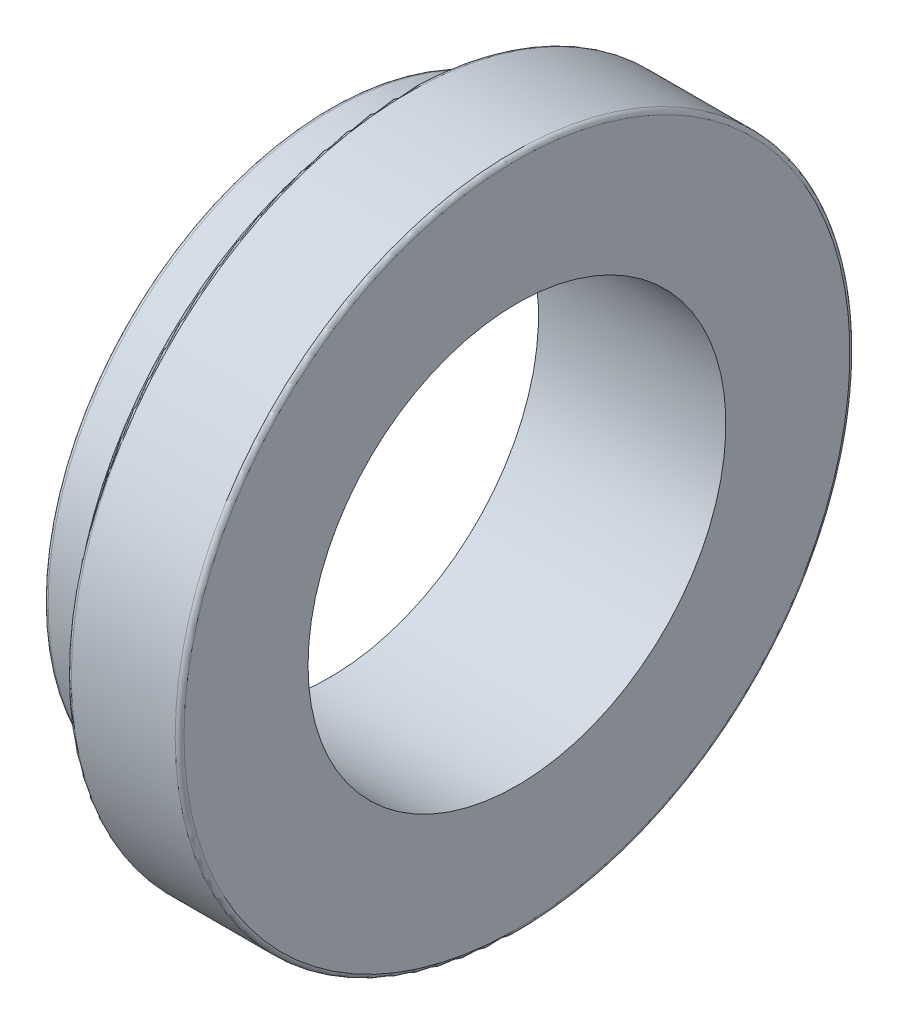
ISO-10303-21;
HEADER;
FILE_DESCRIPTION(('STEP AP214'),'2;1');
FILE_NAME('part.step','',(''),(''),'','','');
FILE_SCHEMA(('AUTOMOTIVE_DESIGN { 1 0 10303 214 1 1 1 1 }'));
ENDSEC;
DATA;
#1=APPLICATION_CONTEXT('core data for automotive mechanical design processes');
#2=APPLICATION_PROTOCOL_DEFINITION('international standard','automotive_design',2000,#1);
#3=PRODUCT_CONTEXT('',#1,'mechanical');
#4=PRODUCT('Part','Part','',(#3));
#5=PRODUCT_RELATED_PRODUCT_CATEGORY('part','',(#4));
#6=PRODUCT_DEFINITION_FORMATION('','',#4);
#7=PRODUCT_DEFINITION_CONTEXT('part definition',#1,'design');
#8=PRODUCT_DEFINITION('design','',#6,#7);
#9=PRODUCT_DEFINITION_SHAPE('','',#8);
#10=(LENGTH_UNIT() NAMED_UNIT(*) SI_UNIT(.MILLI.,.METRE.));
#11=(NAMED_UNIT(*) PLANE_ANGLE_UNIT() SI_UNIT($,.RADIAN.));
#12=(NAMED_UNIT(*) SI_UNIT($,.STERADIAN.) SOLID_ANGLE_UNIT());
#13=UNCERTAINTY_MEASURE_WITH_UNIT(LENGTH_MEASURE(1.E-05),#10,'distance_accuracy_value','');
#14=(GEOMETRIC_REPRESENTATION_CONTEXT(3) GLOBAL_UNCERTAINTY_ASSIGNED_CONTEXT((#13)) GLOBAL_UNIT_ASSIGNED_CONTEXT((#10,
#11,#12)) REPRESENTATION_CONTEXT('',''));
#15=CARTESIAN_POINT('',(0.,0.,0.));
#16=DIRECTION('',(0.,0.,1.));
#17=DIRECTION('',(1.,0.,0.));
#18=AXIS2_PLACEMENT_3D('',#15,#16,#17);
#19=CARTESIAN_POINT('',(0.,0.,0.));
#20=DIRECTION('',(-1.,0.,0.));
#21=DIRECTION('',(0.,0.,1.));
#22=AXIS2_PLACEMENT_3D('',#19,#20,#21);
#23=CYLINDRICAL_SURFACE('',#22,30.1625);
#24=CARTESIAN_POINT('',(28.8469461891185,0.,0.));
#25=DIRECTION('',(-1.,0.,0.));
#26=DIRECTION('',(0.,0.,1.));
#27=AXIS2_PLACEMENT_3D('',#24,#25,#26);
#28=CIRCLE('',#27,30.1625);
#29=CARTESIAN_POINT('',(28.8469461891185,0.,30.1625));
#30=VERTEX_POINT('',#29);
#31=EDGE_CURVE('E75',#30,#30,#28,.T.);
#32=ORIENTED_EDGE('',*,*,#31,.F.);
#33=EDGE_LOOP('',(#32));
#34=FACE_BOUND('',#33,.T.);
#35=CARTESIAN_POINT('',(1.79594618911854,0.,0.));
#36=DIRECTION('',(-1.,0.,0.));
#37=DIRECTION('',(0.,0.,1.));
#38=AXIS2_PLACEMENT_3D('',#35,#36,#37);
#39=CIRCLE('',#38,30.1625);
#40=CARTESIAN_POINT('',(1.79594618911854,0.,30.1625));
#41=VERTEX_POINT('',#40);
#42=EDGE_CURVE('E10',#41,#41,#39,.T.);
#43=ORIENTED_EDGE('',*,*,#42,.T.);
#44=EDGE_LOOP('',(#43));
#45=FACE_BOUND('',#44,.T.);
#46=ADVANCED_FACE('F32',(#34,#45),#23,.F.);
#47=CARTESIAN_POINT('',(1.79594618911854,30.1625,0.));
#48=DIRECTION('',(1.,0.,0.));
#49=DIRECTION('',(0.,0.,-1.));
#50=AXIS2_PLACEMENT_3D('',#47,#48,#49);
#51=PLANE('',#50);
#52=ORIENTED_EDGE('',*,*,#42,.F.);
#53=EDGE_LOOP('',(#52));
#54=FACE_BOUND('',#53,.T.);
#55=CARTESIAN_POINT('',(1.79594618911854,0.,0.));
#56=DIRECTION('',(-1.,0.,0.));
#57=DIRECTION('',(0.,0.,1.));
#58=AXIS2_PLACEMENT_3D('',#55,#56,#57);
#59=CIRCLE('',#58,40.64);
#60=CARTESIAN_POINT('',(1.79594618911854,0.,40.64));
#61=VERTEX_POINT('',#60);
#62=EDGE_CURVE('E38',#61,#61,#59,.T.);
#63=ORIENTED_EDGE('',*,*,#62,.T.);
#64=EDGE_LOOP('',(#63));
#65=FACE_BOUND('',#64,.T.);
#66=ADVANCED_FACE('F82',(#54,#65),#51,.F.);
#67=CARTESIAN_POINT('',(2.43094618911854,0.,0.));
#68=DIRECTION('',(-1.,0.,0.));
#69=DIRECTION('',(0.,0.,1.));
#70=AXIS2_PLACEMENT_3D('',#67,#68,#69);
#71=TOROIDAL_SURFACE('',#70,40.64,0.634999999999998);
#72=ORIENTED_EDGE('',*,*,#62,.F.);
#73=EDGE_LOOP('',(#72));
#74=FACE_BOUND('',#73,.T.);
#75=CARTESIAN_POINT('',(2.43094618911854,0.,0.));
#76=DIRECTION('',(-1.,0.,0.));
#77=DIRECTION('',(0.,0.,1.));
#78=AXIS2_PLACEMENT_3D('',#75,#76,#77);
#79=CIRCLE('',#78,41.275);
#80=CARTESIAN_POINT('',(2.43094618911854,0.,41.275));
#81=VERTEX_POINT('',#80);
#82=EDGE_CURVE('E42',#81,#81,#79,.T.);
#83=ORIENTED_EDGE('',*,*,#82,.T.);
#84=EDGE_LOOP('',(#83));
#85=FACE_BOUND('',#84,.T.);
#86=ADVANCED_FACE('F86',(#74,#85),#71,.T.);
#87=CARTESIAN_POINT('',(0.,0.,0.));
#88=DIRECTION('',(-1.,0.,0.));
#89=DIRECTION('',(0.,0.,1.));
#90=AXIS2_PLACEMENT_3D('',#87,#88,#89);
#91=CYLINDRICAL_SURFACE('',#90,41.275);
#92=ORIENTED_EDGE('',*,*,#82,.F.);
#93=EDGE_LOOP('',(#92));
#94=FACE_BOUND('',#93,.T.);
#95=CARTESIAN_POINT('',(10.6859461891185,0.,0.));
#96=DIRECTION('',(-1.,0.,0.));
#97=DIRECTION('',(0.,0.,1.));
#98=AXIS2_PLACEMENT_3D('',#95,#96,#97);
#99=CIRCLE('',#98,41.275);
#100=CARTESIAN_POINT('',(10.6859461891185,0.,41.275));
#101=VERTEX_POINT('',#100);
#102=EDGE_CURVE('E46',#101,#101,#99,.T.);
#103=ORIENTED_EDGE('',*,*,#102,.T.);
#104=EDGE_LOOP('',(#103));
#105=FACE_BOUND('',#104,.T.);
#106=ADVANCED_FACE('F91',(#94,#105),#91,.T.);
#107=CARTESIAN_POINT('',(10.6859461891185,45.7835,0.));
#108=DIRECTION('',(1.,0.,0.));
#109=DIRECTION('',(0.,0.,-1.));
#110=AXIS2_PLACEMENT_3D('',#107,#108,#109);
#111=PLANE('',#110);
#112=ORIENTED_EDGE('',*,*,#102,.F.);
#113=EDGE_LOOP('',(#112));
#114=FACE_BOUND('',#113,.T.);
#115=CARTESIAN_POINT('',(10.6859461891185,0.,0.));
#116=DIRECTION('',(-1.,0.,0.));
#117=DIRECTION('',(0.,0.,1.));
#118=AXIS2_PLACEMENT_3D('',#115,#116,#117);
#119=CIRCLE('',#118,45.7835);
#120=CARTESIAN_POINT('',(10.6859461891185,0.,45.7835));
#121=VERTEX_POINT('',#120);
#122=EDGE_CURVE('E51',#121,#121,#119,.T.);
#123=ORIENTED_EDGE('',*,*,#122,.T.);
#124=EDGE_LOOP('',(#123));
#125=FACE_BOUND('',#124,.T.);
#126=ADVANCED_FACE('F97',(#114,#125),#111,.F.);
#127=CARTESIAN_POINT('',(10.9399461891185,0.,0.));
#128=DIRECTION('',(-1.,0.,0.));
#129=DIRECTION('',(0.,0.,1.));
#130=AXIS2_PLACEMENT_3D('',#127,#128,#129);
#131=TOROIDAL_SURFACE('',#130,45.7835,0.254000000000003);
#132=ORIENTED_EDGE('',*,*,#122,.F.);
#133=EDGE_LOOP('',(#132));
#134=FACE_BOUND('',#133,.T.);
#135=CARTESIAN_POINT('',(10.9399461891185,0.,0.));
#136=DIRECTION('',(-1.,0.,0.));
#137=DIRECTION('',(0.,0.,1.));
#138=AXIS2_PLACEMENT_3D('',#135,#136,#137);
#139=CIRCLE('',#138,46.0375);
#140=CARTESIAN_POINT('',(10.9399461891185,0.,46.0375));
#141=VERTEX_POINT('',#140);
#142=EDGE_CURVE('E54',#141,#141,#139,.T.);
#143=ORIENTED_EDGE('',*,*,#142,.T.);
#144=EDGE_LOOP('',(#143));
#145=FACE_BOUND('',#144,.T.);
#146=ADVANCED_FACE('F101',(#134,#145),#131,.T.);
#147=CARTESIAN_POINT('',(0.,0.,0.));
#148=DIRECTION('',(-1.,0.,0.));
#149=DIRECTION('',(0.,0.,1.));
#150=AXIS2_PLACEMENT_3D('',#147,#148,#149);
#151=CYLINDRICAL_SURFACE('',#150,46.0375);
#152=ORIENTED_EDGE('',*,*,#142,.F.);
#153=EDGE_LOOP('',(#152));
#154=FACE_BOUND('',#153,.T.);
#155=CARTESIAN_POINT('',(12.3247488679992,0.,0.));
#156=DIRECTION('',(-1.,0.,0.));
#157=DIRECTION('',(0.,0.,1.));
#158=AXIS2_PLACEMENT_3D('',#155,#156,#157);
#159=CIRCLE('',#158,46.0375);
#160=CARTESIAN_POINT('',(12.3247488679992,0.,46.0375));
#161=VERTEX_POINT('',#160);
#162=EDGE_CURVE('E57',#161,#161,#159,.T.);
#163=ORIENTED_EDGE('',*,*,#162,.T.);
#164=EDGE_LOOP('',(#163));
#165=FACE_BOUND('',#164,.T.);
#166=ADVANCED_FACE('F105',(#154,#165),#151,.T.);
#167=CARTESIAN_POINT('',(12.3247488679992,0.,0.));
#168=DIRECTION('',(-1.,0.,0.));
#169=DIRECTION('',(0.,0.,1.));
#170=AXIS2_PLACEMENT_3D('',#167,#168,#169);
#171=TOROIDAL_SURFACE('',#170,46.2915,0.253999999999999);
#172=ORIENTED_EDGE('',*,*,#162,.F.);
#173=EDGE_LOOP('',(#172));
#174=FACE_BOUND('',#173,.T.);
#175=CARTESIAN_POINT('',(12.5787488679992,0.,0.));
#176=DIRECTION('',(-1.,0.,0.));
#177=DIRECTION('',(0.,0.,1.));
#178=AXIS2_PLACEMENT_3D('',#175,#176,#177);
#179=CIRCLE('',#178,46.2915);
#180=CARTESIAN_POINT('',(12.5787488679992,0.,46.2915));
#181=VERTEX_POINT('',#180);
#182=EDGE_CURVE('E60',#181,#181,#179,.T.);
#183=ORIENTED_EDGE('',*,*,#182,.T.);
#184=EDGE_LOOP('',(#183));
#185=FACE_BOUND('',#184,.T.);
#186=ADVANCED_FACE('F109',(#174,#185),#171,.F.);
#187=CARTESIAN_POINT('',(12.5787488679992,46.2915,0.));
#188=DIRECTION('',(1.,0.,0.));
#189=DIRECTION('',(0.,0.,-1.));
#190=AXIS2_PLACEMENT_3D('',#187,#188,#189);
#191=PLANE('',#190);
#192=ORIENTED_EDGE('',*,*,#182,.F.);
#193=EDGE_LOOP('',(#192));
#194=FACE_BOUND('',#193,.T.);
#195=CARTESIAN_POINT('',(12.5787488679992,0.,0.));
#196=DIRECTION('',(-1.,0.,0.));
#197=DIRECTION('',(0.,0.,1.));
#198=AXIS2_PLACEMENT_3D('',#195,#196,#197);
#199=CIRCLE('',#198,48.0695);
#200=CARTESIAN_POINT('',(12.5787488679992,0.,48.0695));
#201=VERTEX_POINT('',#200);
#202=EDGE_CURVE('E63',#201,#201,#199,.T.);
#203=ORIENTED_EDGE('',*,*,#202,.T.);
#204=EDGE_LOOP('',(#203));
#205=FACE_BOUND('',#204,.T.);
#206=ADVANCED_FACE('F113',(#194,#205),#191,.F.);
#207=CARTESIAN_POINT('',(13.2137488679992,0.,0.));
#208=DIRECTION('',(-1.,0.,0.));
#209=DIRECTION('',(0.,0.,1.));
#210=AXIS2_PLACEMENT_3D('',#207,#208,#209);
#211=TOROIDAL_SURFACE('',#210,48.0695,0.634999999999996);
#212=ORIENTED_EDGE('',*,*,#202,.F.);
#213=EDGE_LOOP('',(#212));
#214=FACE_BOUND('',#213,.T.);
#215=CARTESIAN_POINT('',(13.2137488679992,0.,0.));
#216=DIRECTION('',(-1.,0.,0.));
#217=DIRECTION('',(0.,0.,1.));
#218=AXIS2_PLACEMENT_3D('',#215,#216,#217);
#219=CIRCLE('',#218,48.7045);
#220=CARTESIAN_POINT('',(13.2137488679992,0.,48.7045));
#221=VERTEX_POINT('',#220);
#222=EDGE_CURVE('E66',#221,#221,#219,.T.);
#223=ORIENTED_EDGE('',*,*,#222,.T.);
#224=EDGE_LOOP('',(#223));
#225=FACE_BOUND('',#224,.T.);
#226=ADVANCED_FACE('F117',(#214,#225),#211,.T.);
#227=CARTESIAN_POINT('',(0.,0.,0.));
#228=DIRECTION('',(-1.,0.,0.));
#229=DIRECTION('',(0.,0.,1.));
#230=AXIS2_PLACEMENT_3D('',#227,#228,#229);
#231=CYLINDRICAL_SURFACE('',#230,48.7045);
#232=ORIENTED_EDGE('',*,*,#222,.F.);
#233=EDGE_LOOP('',(#232));
#234=FACE_BOUND('',#233,.T.);
#235=CARTESIAN_POINT('',(28.2119461891185,0.,0.));
#236=DIRECTION('',(-1.,0.,0.));
#237=DIRECTION('',(0.,0.,1.));
#238=AXIS2_PLACEMENT_3D('',#235,#236,#237);
#239=CIRCLE('',#238,48.7045);
#240=CARTESIAN_POINT('',(28.2119461891185,0.,48.7045));
#241=VERTEX_POINT('',#240);
#242=EDGE_CURVE('E69',#241,#241,#239,.T.);
#243=ORIENTED_EDGE('',*,*,#242,.T.);
#244=EDGE_LOOP('',(#243));
#245=FACE_BOUND('',#244,.T.);
#246=ADVANCED_FACE('F121',(#234,#245),#231,.T.);
#247=CARTESIAN_POINT('',(28.2119461891185,0.,0.));
#248=DIRECTION('',(-1.,0.,0.));
#249=DIRECTION('',(0.,0.,1.));
#250=AXIS2_PLACEMENT_3D('',#247,#248,#249);
#251=TOROIDAL_SURFACE('',#250,48.0695,0.634999999999998);
#252=ORIENTED_EDGE('',*,*,#242,.F.);
#253=EDGE_LOOP('',(#252));
#254=FACE_BOUND('',#253,.T.);
#255=CARTESIAN_POINT('',(28.8469461891185,0.,0.));
#256=DIRECTION('',(-1.,0.,0.));
#257=DIRECTION('',(0.,0.,1.));
#258=AXIS2_PLACEMENT_3D('',#255,#256,#257);
#259=CIRCLE('',#258,48.0695);
#260=CARTESIAN_POINT('',(28.8469461891185,0.,48.0695));
#261=VERTEX_POINT('',#260);
#262=EDGE_CURVE('E72',#261,#261,#259,.T.);
#263=ORIENTED_EDGE('',*,*,#262,.T.);
#264=EDGE_LOOP('',(#263));
#265=FACE_BOUND('',#264,.T.);
#266=ADVANCED_FACE('F125',(#254,#265),#251,.T.);
#267=CARTESIAN_POINT('',(28.8469461891185,48.0695,0.));
#268=DIRECTION('',(-1.,0.,0.));
#269=DIRECTION('',(0.,0.,1.));
#270=AXIS2_PLACEMENT_3D('',#267,#268,#269);
#271=PLANE('',#270);
#272=ORIENTED_EDGE('',*,*,#262,.F.);
#273=EDGE_LOOP('',(#272));
#274=FACE_BOUND('',#273,.T.);
#275=ORIENTED_EDGE('',*,*,#31,.T.);
#276=EDGE_LOOP('',(#275));
#277=FACE_BOUND('',#276,.T.);
#278=ADVANCED_FACE('F79',(#274,#277),#271,.F.);
#279=CLOSED_SHELL('',(#46,#66,#86,#106,#126,#146,#166,#186,#206,#226,#246,#266,#278));
#280=MANIFOLD_SOLID_BREP('B2',#279);
#281=ADVANCED_BREP_SHAPE_REPRESENTATION('',(#18,#280),#14);
#282=SHAPE_DEFINITION_REPRESENTATION(#9,#281);
ENDSEC;
END-ISO-10303-21;
